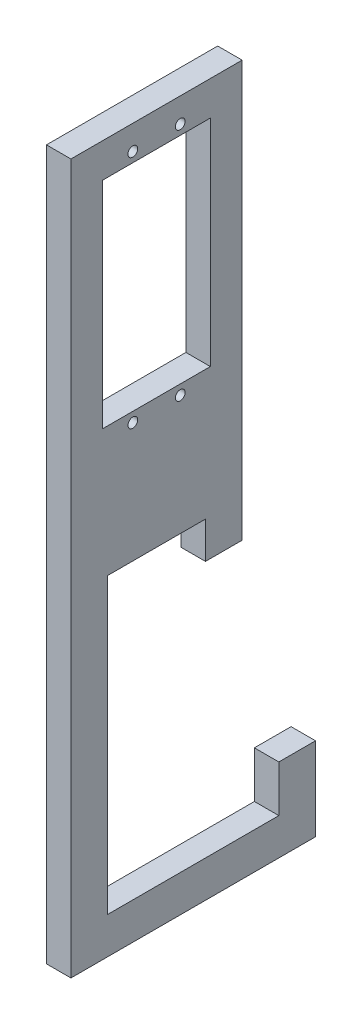
ISO-10303-21;
HEADER;
FILE_DESCRIPTION(('STEP AP214'),'2;1');
FILE_NAME('part.step','',(''),(''),'','','');
FILE_SCHEMA(('AUTOMOTIVE_DESIGN { 1 0 10303 214 1 1 1 1 }'));
ENDSEC;
DATA;
#1=APPLICATION_CONTEXT('core data for automotive mechanical design processes');
#2=APPLICATION_PROTOCOL_DEFINITION('international standard','automotive_design',2000,#1);
#3=PRODUCT_CONTEXT('',#1,'mechanical');
#4=PRODUCT('Part','Part','',(#3));
#5=PRODUCT_RELATED_PRODUCT_CATEGORY('part','',(#4));
#6=PRODUCT_DEFINITION_FORMATION('','',#4);
#7=PRODUCT_DEFINITION_CONTEXT('part definition',#1,'design');
#8=PRODUCT_DEFINITION('design','',#6,#7);
#9=PRODUCT_DEFINITION_SHAPE('','',#8);
#10=(LENGTH_UNIT() NAMED_UNIT(*) SI_UNIT(.MILLI.,.METRE.));
#11=(NAMED_UNIT(*) PLANE_ANGLE_UNIT() SI_UNIT($,.RADIAN.));
#12=(NAMED_UNIT(*) SI_UNIT($,.STERADIAN.) SOLID_ANGLE_UNIT());
#13=UNCERTAINTY_MEASURE_WITH_UNIT(LENGTH_MEASURE(1.E-05),#10,'distance_accuracy_value','');
#14=(GEOMETRIC_REPRESENTATION_CONTEXT(3) GLOBAL_UNCERTAINTY_ASSIGNED_CONTEXT((#13)) GLOBAL_UNIT_ASSIGNED_CONTEXT((#10,
#11,#12)) REPRESENTATION_CONTEXT('',''));
#15=CARTESIAN_POINT('',(0.,0.,0.));
#16=DIRECTION('',(0.,0.,1.));
#17=DIRECTION('',(1.,0.,0.));
#18=AXIS2_PLACEMENT_3D('',#15,#16,#17);
#19=CARTESIAN_POINT('',(2.5,0.,0.));
#20=DIRECTION('',(1.,0.,0.));
#21=DIRECTION('',(0.,0.,-1.));
#22=AXIS2_PLACEMENT_3D('',#19,#20,#21);
#23=PLANE('',#22);
#24=CARTESIAN_POINT('',(2.5,24.,-4.85));
#25=DIRECTION('',(1.,0.,0.));
#26=DIRECTION('',(0.,0.,-1.));
#27=AXIS2_PLACEMENT_3D('',#24,#25,#26);
#28=CIRCLE('',#27,1.);
#29=CARTESIAN_POINT('',(2.5,24.,-5.85));
#30=VERTEX_POINT('',#29);
#31=EDGE_CURVE('E287',#30,#30,#28,.T.);
#32=ORIENTED_EDGE('',*,*,#31,.F.);
#33=EDGE_LOOP('',(#32));
#34=FACE_BOUND('',#33,.T.);
#35=CARTESIAN_POINT('',(2.5,-24.,4.85));
#36=DIRECTION('',(1.,0.,0.));
#37=DIRECTION('',(0.,0.,-1.));
#38=AXIS2_PLACEMENT_3D('',#35,#36,#37);
#39=CIRCLE('',#38,1.);
#40=CARTESIAN_POINT('',(2.5,-24.,3.85));
#41=VERTEX_POINT('',#40);
#42=EDGE_CURVE('E303',#41,#41,#39,.T.);
#43=ORIENTED_EDGE('',*,*,#42,.F.);
#44=EDGE_LOOP('',(#43));
#45=FACE_BOUND('',#44,.T.);
#46=DIRECTION('',(0.,-1.,0.));
#47=VECTOR('',#46,1.);
#48=CARTESIAN_POINT('',(2.5,29.,17.5));
#49=LINE('',#48,#47);
#50=CARTESIAN_POINT('',(2.5,29.,17.5));
#51=VERTEX_POINT('',#50);
#52=CARTESIAN_POINT('',(2.5,-116.,17.5));
#53=VERTEX_POINT('',#52);
#54=EDGE_CURVE('E346',#51,#53,#49,.T.);
#55=ORIENTED_EDGE('',*,*,#54,.T.);
#56=DIRECTION('',(0.,0.,-1.));
#57=VECTOR('',#56,1.);
#58=CARTESIAN_POINT('',(2.5,-116.,-32.5));
#59=LINE('',#58,#57);
#60=CARTESIAN_POINT('',(2.5,-116.,-32.5));
#61=VERTEX_POINT('',#60);
#62=EDGE_CURVE('E175',#53,#61,#59,.T.);
#63=ORIENTED_EDGE('',*,*,#62,.T.);
#64=DIRECTION('',(0.,1.,0.));
#65=VECTOR('',#64,1.);
#66=CARTESIAN_POINT('',(2.5,-99.,-32.5));
#67=LINE('',#66,#65);
#68=CARTESIAN_POINT('',(2.5,-99.,-32.5));
#69=VERTEX_POINT('',#68);
#70=EDGE_CURVE('E246',#61,#69,#67,.T.);
#71=ORIENTED_EDGE('',*,*,#70,.T.);
#72=DIRECTION('',(0.,0.,1.));
#73=VECTOR('',#72,1.);
#74=CARTESIAN_POINT('',(2.5,-99.,-25.));
#75=LINE('',#74,#73);
#76=CARTESIAN_POINT('',(2.5,-99.,-25.));
#77=VERTEX_POINT('',#76);
#78=EDGE_CURVE('E242',#69,#77,#75,.T.);
#79=ORIENTED_EDGE('',*,*,#78,.T.);
#80=DIRECTION('',(0.,-1.,0.));
#81=VECTOR('',#80,1.);
#82=CARTESIAN_POINT('',(2.5,-108.5,-25.));
#83=LINE('',#82,#81);
#84=CARTESIAN_POINT('',(2.5,-108.5,-25.));
#85=VERTEX_POINT('',#84);
#86=EDGE_CURVE('E238',#77,#85,#83,.T.);
#87=ORIENTED_EDGE('',*,*,#86,.T.);
#88=DIRECTION('',(0.,0.,1.));
#89=VECTOR('',#88,1.);
#90=CARTESIAN_POINT('',(2.5,-108.5,9.99999999999998));
#91=LINE('',#90,#89);
#92=CARTESIAN_POINT('',(2.5,-108.5,9.99999999999998));
#93=VERTEX_POINT('',#92);
#94=EDGE_CURVE('E234',#85,#93,#91,.T.);
#95=ORIENTED_EDGE('',*,*,#94,.T.);
#96=DIRECTION('',(0.,1.,0.));
#97=VECTOR('',#96,1.);
#98=CARTESIAN_POINT('',(2.5,-48.5,9.99999999999999));
#99=LINE('',#98,#97);
#100=CARTESIAN_POINT('',(2.5,-48.5,9.99999999999999));
#101=VERTEX_POINT('',#100);
#102=EDGE_CURVE('E230',#93,#101,#99,.T.);
#103=ORIENTED_EDGE('',*,*,#102,.T.);
#104=DIRECTION('',(0.,0.,-1.));
#105=VECTOR('',#104,1.);
#106=CARTESIAN_POINT('',(2.5,-48.5,-9.99999999999999));
#107=LINE('',#106,#105);
#108=CARTESIAN_POINT('',(2.5,-48.5,-9.99999999999999));
#109=VERTEX_POINT('',#108);
#110=EDGE_CURVE('E226',#101,#109,#107,.T.);
#111=ORIENTED_EDGE('',*,*,#110,.T.);
#112=DIRECTION('',(0.,-1.,0.));
#113=VECTOR('',#112,1.);
#114=CARTESIAN_POINT('',(2.5,-56.,-9.99999999999999));
#115=LINE('',#114,#113);
#116=CARTESIAN_POINT('',(2.5,-56.,-9.99999999999999));
#117=VERTEX_POINT('',#116);
#118=EDGE_CURVE('E222',#109,#117,#115,.T.);
#119=ORIENTED_EDGE('',*,*,#118,.T.);
#120=DIRECTION('',(0.,0.,-1.));
#121=VECTOR('',#120,1.);
#122=CARTESIAN_POINT('',(2.5,-56.,-17.5));
#123=LINE('',#122,#121);
#124=CARTESIAN_POINT('',(2.5,-56.,-17.5));
#125=VERTEX_POINT('',#124);
#126=EDGE_CURVE('E217',#117,#125,#123,.T.);
#127=ORIENTED_EDGE('',*,*,#126,.T.);
#128=DIRECTION('',(0.,1.,0.));
#129=VECTOR('',#128,1.);
#130=CARTESIAN_POINT('',(2.5,29.,-17.5));
#131=LINE('',#130,#129);
#132=CARTESIAN_POINT('',(2.5,29.,-17.5));
#133=VERTEX_POINT('',#132);
#134=EDGE_CURVE('E349',#125,#133,#131,.T.);
#135=ORIENTED_EDGE('',*,*,#134,.T.);
#136=DIRECTION('',(0.,0.,1.));
#137=VECTOR('',#136,1.);
#138=CARTESIAN_POINT('',(2.5,29.,17.5));
#139=LINE('',#138,#137);
#140=EDGE_CURVE('E353',#133,#51,#139,.T.);
#141=ORIENTED_EDGE('',*,*,#140,.T.);
#142=EDGE_LOOP('',(#55,#63,#71,#79,#87,#95,#103,#111,#119,#127,#135,#141));
#143=FACE_BOUND('',#142,.T.);
#144=DIRECTION('',(0.,0.,-1.));
#145=VECTOR('',#144,1.);
#146=CARTESIAN_POINT('',(2.5,-22.,11.));
#147=LINE('',#146,#145);
#148=CARTESIAN_POINT('',(2.5,-22.,11.));
#149=VERTEX_POINT('',#148);
#150=CARTESIAN_POINT('',(2.5,-22.,-11.));
#151=VERTEX_POINT('',#150);
#152=EDGE_CURVE('E313',#149,#151,#147,.T.);
#153=ORIENTED_EDGE('',*,*,#152,.F.);
#154=DIRECTION('',(0.,-1.,0.));
#155=VECTOR('',#154,1.);
#156=CARTESIAN_POINT('',(2.5,22.,11.));
#157=LINE('',#156,#155);
#158=CARTESIAN_POINT('',(2.5,22.,11.));
#159=VERTEX_POINT('',#158);
#160=EDGE_CURVE('E310',#159,#149,#157,.T.);
#161=ORIENTED_EDGE('',*,*,#160,.F.);
#162=DIRECTION('',(0.,0.,1.));
#163=VECTOR('',#162,1.);
#164=CARTESIAN_POINT('',(2.5,22.,11.));
#165=LINE('',#164,#163);
#166=CARTESIAN_POINT('',(2.5,22.,-11.));
#167=VERTEX_POINT('',#166);
#168=EDGE_CURVE('E320',#167,#159,#165,.T.);
#169=ORIENTED_EDGE('',*,*,#168,.F.);
#170=DIRECTION('',(0.,1.,0.));
#171=VECTOR('',#170,1.);
#172=CARTESIAN_POINT('',(2.5,22.,-11.));
#173=LINE('',#172,#171);
#174=EDGE_CURVE('E317',#151,#167,#173,.T.);
#175=ORIENTED_EDGE('',*,*,#174,.F.);
#176=EDGE_LOOP('',(#153,#161,#169,#175));
#177=FACE_BOUND('',#176,.T.);
#178=CARTESIAN_POINT('',(2.5,-24.,-4.85));
#179=DIRECTION('',(1.,0.,0.));
#180=DIRECTION('',(0.,0.,-1.));
#181=AXIS2_PLACEMENT_3D('',#178,#179,#180);
#182=CIRCLE('',#181,1.);
#183=CARTESIAN_POINT('',(2.5,-24.,-5.85));
#184=VERTEX_POINT('',#183);
#185=EDGE_CURVE('E295',#184,#184,#182,.T.);
#186=ORIENTED_EDGE('',*,*,#185,.F.);
#187=EDGE_LOOP('',(#186));
#188=FACE_BOUND('',#187,.T.);
#189=CARTESIAN_POINT('',(2.5,24.,4.85));
#190=DIRECTION('',(1.,0.,0.));
#191=DIRECTION('',(0.,0.,-1.));
#192=AXIS2_PLACEMENT_3D('',#189,#190,#191);
#193=CIRCLE('',#192,1.);
#194=CARTESIAN_POINT('',(2.5,24.,3.85));
#195=VERTEX_POINT('',#194);
#196=EDGE_CURVE('E279',#195,#195,#193,.T.);
#197=ORIENTED_EDGE('',*,*,#196,.F.);
#198=EDGE_LOOP('',(#197));
#199=FACE_BOUND('',#198,.T.);
#200=ADVANCED_FACE('F39',(#34,#45,#143,#177,#188,#199),#23,.T.);
#201=CARTESIAN_POINT('',(-2.5,0.,0.));
#202=DIRECTION('',(1.,0.,0.));
#203=DIRECTION('',(0.,0.,-1.));
#204=AXIS2_PLACEMENT_3D('',#201,#202,#203);
#205=PLANE('',#204);
#206=DIRECTION('',(0.,-1.,0.));
#207=VECTOR('',#206,1.);
#208=CARTESIAN_POINT('',(-2.5,29.,17.5));
#209=LINE('',#208,#207);
#210=CARTESIAN_POINT('',(-2.5,29.,17.5));
#211=VERTEX_POINT('',#210);
#212=CARTESIAN_POINT('',(-2.5,-116.,17.5));
#213=VERTEX_POINT('',#212);
#214=EDGE_CURVE('E156',#211,#213,#209,.T.);
#215=ORIENTED_EDGE('',*,*,#214,.F.);
#216=DIRECTION('',(0.,0.,1.));
#217=VECTOR('',#216,1.);
#218=CARTESIAN_POINT('',(-2.5,29.,17.5));
#219=LINE('',#218,#217);
#220=CARTESIAN_POINT('',(-2.5,29.,-17.5));
#221=VERTEX_POINT('',#220);
#222=EDGE_CURVE('E350',#221,#211,#219,.T.);
#223=ORIENTED_EDGE('',*,*,#222,.F.);
#224=DIRECTION('',(0.,1.,0.));
#225=VECTOR('',#224,1.);
#226=CARTESIAN_POINT('',(-2.5,29.,-17.5));
#227=LINE('',#226,#225);
#228=CARTESIAN_POINT('',(-2.5,-56.,-17.5));
#229=VERTEX_POINT('',#228);
#230=EDGE_CURVE('E165',#229,#221,#227,.T.);
#231=ORIENTED_EDGE('',*,*,#230,.F.);
#232=DIRECTION('',(0.,0.,1.));
#233=VECTOR('',#232,1.);
#234=CARTESIAN_POINT('',(-2.5,-56.,-17.5));
#235=LINE('',#234,#233);
#236=CARTESIAN_POINT('',(-2.5,-56.,-9.99999999999999));
#237=VERTEX_POINT('',#236);
#238=EDGE_CURVE('E178',#229,#237,#235,.T.);
#239=ORIENTED_EDGE('',*,*,#238,.T.);
#240=DIRECTION('',(0.,1.,0.));
#241=VECTOR('',#240,1.);
#242=CARTESIAN_POINT('',(-2.5,-56.,-9.99999999999999));
#243=LINE('',#242,#241);
#244=CARTESIAN_POINT('',(-2.5,-48.5,-9.99999999999999));
#245=VERTEX_POINT('',#244);
#246=EDGE_CURVE('E210',#237,#245,#243,.T.);
#247=ORIENTED_EDGE('',*,*,#246,.T.);
#248=DIRECTION('',(0.,0.,1.));
#249=VECTOR('',#248,1.);
#250=CARTESIAN_POINT('',(-2.5,-48.5,-9.99999999999999));
#251=LINE('',#250,#249);
#252=CARTESIAN_POINT('',(-2.5,-48.5,9.99999999999999));
#253=VERTEX_POINT('',#252);
#254=EDGE_CURVE('E206',#245,#253,#251,.T.);
#255=ORIENTED_EDGE('',*,*,#254,.T.);
#256=DIRECTION('',(0.,-1.,0.));
#257=VECTOR('',#256,1.);
#258=CARTESIAN_POINT('',(-2.5,-48.5,9.99999999999999));
#259=LINE('',#258,#257);
#260=CARTESIAN_POINT('',(-2.5,-108.5,9.99999999999998));
#261=VERTEX_POINT('',#260);
#262=EDGE_CURVE('E202',#253,#261,#259,.T.);
#263=ORIENTED_EDGE('',*,*,#262,.T.);
#264=DIRECTION('',(0.,0.,-1.));
#265=VECTOR('',#264,1.);
#266=CARTESIAN_POINT('',(-2.5,-108.5,9.99999999999998));
#267=LINE('',#266,#265);
#268=CARTESIAN_POINT('',(-2.5,-108.5,-25.));
#269=VERTEX_POINT('',#268);
#270=EDGE_CURVE('E198',#261,#269,#267,.T.);
#271=ORIENTED_EDGE('',*,*,#270,.T.);
#272=DIRECTION('',(0.,1.,0.));
#273=VECTOR('',#272,1.);
#274=CARTESIAN_POINT('',(-2.5,-108.5,-25.));
#275=LINE('',#274,#273);
#276=CARTESIAN_POINT('',(-2.5,-99.,-25.));
#277=VERTEX_POINT('',#276);
#278=EDGE_CURVE('E194',#269,#277,#275,.T.);
#279=ORIENTED_EDGE('',*,*,#278,.T.);
#280=DIRECTION('',(0.,0.,-1.));
#281=VECTOR('',#280,1.);
#282=CARTESIAN_POINT('',(-2.5,-99.,-25.));
#283=LINE('',#282,#281);
#284=CARTESIAN_POINT('',(-2.5,-99.,-32.5));
#285=VERTEX_POINT('',#284);
#286=EDGE_CURVE('E189',#277,#285,#283,.T.);
#287=ORIENTED_EDGE('',*,*,#286,.T.);
#288=DIRECTION('',(0.,-1.,0.));
#289=VECTOR('',#288,1.);
#290=CARTESIAN_POINT('',(-2.5,-99.,-32.5));
#291=LINE('',#290,#289);
#292=CARTESIAN_POINT('',(-2.5,-116.,-32.5));
#293=VERTEX_POINT('',#292);
#294=EDGE_CURVE('E185',#285,#293,#291,.T.);
#295=ORIENTED_EDGE('',*,*,#294,.T.);
#296=DIRECTION('',(0.,0.,1.));
#297=VECTOR('',#296,1.);
#298=CARTESIAN_POINT('',(-2.5,-116.,-32.5));
#299=LINE('',#298,#297);
#300=EDGE_CURVE('E173',#293,#213,#299,.T.);
#301=ORIENTED_EDGE('',*,*,#300,.T.);
#302=EDGE_LOOP('',(#215,#223,#231,#239,#247,#255,#263,#271,#279,#287,#295,#301));
#303=FACE_BOUND('',#302,.T.);
#304=DIRECTION('',(0.,-1.,0.));
#305=VECTOR('',#304,1.);
#306=CARTESIAN_POINT('',(-2.5,22.,11.));
#307=LINE('',#306,#305);
#308=CARTESIAN_POINT('',(-2.5,22.,11.));
#309=VERTEX_POINT('',#308);
#310=CARTESIAN_POINT('',(-2.5,-22.,11.));
#311=VERTEX_POINT('',#310);
#312=EDGE_CURVE('E63',#309,#311,#307,.T.);
#313=ORIENTED_EDGE('',*,*,#312,.T.);
#314=DIRECTION('',(0.,0.,-1.));
#315=VECTOR('',#314,1.);
#316=CARTESIAN_POINT('',(-2.5,-22.,11.));
#317=LINE('',#316,#315);
#318=CARTESIAN_POINT('',(-2.5,-22.,-11.));
#319=VERTEX_POINT('',#318);
#320=EDGE_CURVE('E326',#311,#319,#317,.T.);
#321=ORIENTED_EDGE('',*,*,#320,.T.);
#322=DIRECTION('',(0.,1.,0.));
#323=VECTOR('',#322,1.);
#324=CARTESIAN_POINT('',(-2.5,22.,-11.));
#325=LINE('',#324,#323);
#326=CARTESIAN_POINT('',(-2.5,22.,-11.));
#327=VERTEX_POINT('',#326);
#328=EDGE_CURVE('E330',#319,#327,#325,.T.);
#329=ORIENTED_EDGE('',*,*,#328,.T.);
#330=DIRECTION('',(0.,0.,1.));
#331=VECTOR('',#330,1.);
#332=CARTESIAN_POINT('',(-2.5,22.,11.));
#333=LINE('',#332,#331);
#334=EDGE_CURVE('E314',#327,#309,#333,.T.);
#335=ORIENTED_EDGE('',*,*,#334,.T.);
#336=EDGE_LOOP('',(#313,#321,#329,#335));
#337=FACE_BOUND('',#336,.T.);
#338=CARTESIAN_POINT('',(-2.5,-24.,4.85));
#339=DIRECTION('',(1.,0.,0.));
#340=DIRECTION('',(0.,0.,-1.));
#341=AXIS2_PLACEMENT_3D('',#338,#339,#340);
#342=CIRCLE('',#341,1.);
#343=CARTESIAN_POINT('',(-2.5,-24.,3.85));
#344=VERTEX_POINT('',#343);
#345=EDGE_CURVE('E299',#344,#344,#342,.T.);
#346=ORIENTED_EDGE('',*,*,#345,.T.);
#347=EDGE_LOOP('',(#346));
#348=FACE_BOUND('',#347,.T.);
#349=CARTESIAN_POINT('',(-2.5,-24.,-4.85));
#350=DIRECTION('',(1.,0.,0.));
#351=DIRECTION('',(0.,0.,-1.));
#352=AXIS2_PLACEMENT_3D('',#349,#350,#351);
#353=CIRCLE('',#352,1.);
#354=CARTESIAN_POINT('',(-2.5,-24.,-5.85));
#355=VERTEX_POINT('',#354);
#356=EDGE_CURVE('E291',#355,#355,#353,.T.);
#357=ORIENTED_EDGE('',*,*,#356,.T.);
#358=EDGE_LOOP('',(#357));
#359=FACE_BOUND('',#358,.T.);
#360=CARTESIAN_POINT('',(-2.5,24.,-4.85));
#361=DIRECTION('',(1.,0.,0.));
#362=DIRECTION('',(0.,0.,-1.));
#363=AXIS2_PLACEMENT_3D('',#360,#361,#362);
#364=CIRCLE('',#363,1.);
#365=CARTESIAN_POINT('',(-2.5,24.,-5.85));
#366=VERTEX_POINT('',#365);
#367=EDGE_CURVE('E283',#366,#366,#364,.T.);
#368=ORIENTED_EDGE('',*,*,#367,.T.);
#369=EDGE_LOOP('',(#368));
#370=FACE_BOUND('',#369,.T.);
#371=CARTESIAN_POINT('',(-2.5,24.,4.85));
#372=DIRECTION('',(1.,0.,0.));
#373=DIRECTION('',(0.,0.,-1.));
#374=AXIS2_PLACEMENT_3D('',#371,#372,#373);
#375=CIRCLE('',#374,1.);
#376=CARTESIAN_POINT('',(-2.5,24.,3.85));
#377=VERTEX_POINT('',#376);
#378=EDGE_CURVE('E221',#377,#377,#375,.T.);
#379=ORIENTED_EDGE('',*,*,#378,.T.);
#380=EDGE_LOOP('',(#379));
#381=FACE_BOUND('',#380,.T.);
#382=ADVANCED_FACE('F181',(#303,#337,#348,#359,#370,#381),#205,.F.);
#383=CARTESIAN_POINT('',(2.5,29.,17.5));
#384=DIRECTION('',(0.,0.,-1.));
#385=DIRECTION('',(0.,1.,0.));
#386=AXIS2_PLACEMENT_3D('',#383,#384,#385);
#387=PLANE('',#386);
#388=ORIENTED_EDGE('',*,*,#214,.T.);
#389=DIRECTION('',(-1.,0.,0.));
#390=VECTOR('',#389,1.);
#391=CARTESIAN_POINT('',(92.6387818865997,-116.,17.5));
#392=LINE('',#391,#390);
#393=EDGE_CURVE('E159',#53,#213,#392,.T.);
#394=ORIENTED_EDGE('',*,*,#393,.F.);
#395=ORIENTED_EDGE('',*,*,#54,.F.);
#396=DIRECTION('',(-1.,0.,0.));
#397=VECTOR('',#396,1.);
#398=CARTESIAN_POINT('',(2.5,29.,17.5));
#399=LINE('',#398,#397);
#400=EDGE_CURVE('E48',#51,#211,#399,.T.);
#401=ORIENTED_EDGE('',*,*,#400,.T.);
#402=EDGE_LOOP('',(#388,#394,#395,#401));
#403=FACE_BOUND('',#402,.T.);
#404=ADVANCED_FACE('F41',(#403),#387,.F.);
#405=CARTESIAN_POINT('',(2.5,29.,-17.5));
#406=DIRECTION('',(0.,0.,1.));
#407=DIRECTION('',(0.,-1.,0.));
#408=AXIS2_PLACEMENT_3D('',#405,#406,#407);
#409=PLANE('',#408);
#410=ORIENTED_EDGE('',*,*,#230,.T.);
#411=DIRECTION('',(-1.,0.,0.));
#412=VECTOR('',#411,1.);
#413=CARTESIAN_POINT('',(2.5,29.,-17.5));
#414=LINE('',#413,#412);
#415=EDGE_CURVE('E11',#133,#221,#414,.T.);
#416=ORIENTED_EDGE('',*,*,#415,.F.);
#417=ORIENTED_EDGE('',*,*,#134,.F.);
#418=DIRECTION('',(-1.,0.,0.));
#419=VECTOR('',#418,1.);
#420=CARTESIAN_POINT('',(92.6387818865997,-56.,-17.5));
#421=LINE('',#420,#419);
#422=EDGE_CURVE('E251',#125,#229,#421,.T.);
#423=ORIENTED_EDGE('',*,*,#422,.T.);
#424=EDGE_LOOP('',(#410,#416,#417,#423));
#425=FACE_BOUND('',#424,.T.);
#426=ADVANCED_FACE('F368',(#425),#409,.F.);
#427=CARTESIAN_POINT('',(2.5,29.,17.5));
#428=DIRECTION('',(0.,-1.,0.));
#429=DIRECTION('',(0.,0.,-1.));
#430=AXIS2_PLACEMENT_3D('',#427,#428,#429);
#431=PLANE('',#430);
#432=ORIENTED_EDGE('',*,*,#222,.T.);
#433=ORIENTED_EDGE('',*,*,#400,.F.);
#434=ORIENTED_EDGE('',*,*,#140,.F.);
#435=ORIENTED_EDGE('',*,*,#415,.T.);
#436=EDGE_LOOP('',(#432,#433,#434,#435));
#437=FACE_BOUND('',#436,.T.);
#438=ADVANCED_FACE('F361',(#437),#431,.F.);
#439=CARTESIAN_POINT('',(2.5,22.,11.));
#440=DIRECTION('',(0.,0.,-1.));
#441=DIRECTION('',(0.,1.,0.));
#442=AXIS2_PLACEMENT_3D('',#439,#440,#441);
#443=PLANE('',#442);
#444=ORIENTED_EDGE('',*,*,#312,.F.);
#445=DIRECTION('',(-1.,0.,0.));
#446=VECTOR('',#445,1.);
#447=CARTESIAN_POINT('',(2.5,22.,11.));
#448=LINE('',#447,#446);
#449=EDGE_CURVE('E323',#159,#309,#448,.T.);
#450=ORIENTED_EDGE('',*,*,#449,.F.);
#451=ORIENTED_EDGE('',*,*,#160,.T.);
#452=DIRECTION('',(-1.,0.,0.));
#453=VECTOR('',#452,1.);
#454=CARTESIAN_POINT('',(2.5,-22.,11.));
#455=LINE('',#454,#453);
#456=EDGE_CURVE('E166',#149,#311,#455,.T.);
#457=ORIENTED_EDGE('',*,*,#456,.T.);
#458=EDGE_LOOP('',(#444,#450,#451,#457));
#459=FACE_BOUND('',#458,.T.);
#460=ADVANCED_FACE('F418',(#459),#443,.T.);
#461=CARTESIAN_POINT('',(2.5,-22.,11.));
#462=DIRECTION('',(0.,1.,0.));
#463=DIRECTION('',(0.,0.,1.));
#464=AXIS2_PLACEMENT_3D('',#461,#462,#463);
#465=PLANE('',#464);
#466=ORIENTED_EDGE('',*,*,#320,.F.);
#467=ORIENTED_EDGE('',*,*,#456,.F.);
#468=ORIENTED_EDGE('',*,*,#152,.T.);
#469=DIRECTION('',(-1.,0.,0.));
#470=VECTOR('',#469,1.);
#471=CARTESIAN_POINT('',(2.5,-22.,-11.));
#472=LINE('',#471,#470);
#473=EDGE_CURVE('E341',#151,#319,#472,.T.);
#474=ORIENTED_EDGE('',*,*,#473,.T.);
#475=EDGE_LOOP('',(#466,#467,#468,#474));
#476=FACE_BOUND('',#475,.T.);
#477=ADVANCED_FACE('F496',(#476),#465,.T.);
#478=CARTESIAN_POINT('',(2.5,22.,-11.));
#479=DIRECTION('',(0.,0.,1.));
#480=DIRECTION('',(1.,0.,0.));
#481=AXIS2_PLACEMENT_3D('',#478,#479,#480);
#482=PLANE('',#481);
#483=ORIENTED_EDGE('',*,*,#328,.F.);
#484=ORIENTED_EDGE('',*,*,#473,.F.);
#485=ORIENTED_EDGE('',*,*,#174,.T.);
#486=DIRECTION('',(-1.,0.,0.));
#487=VECTOR('',#486,1.);
#488=CARTESIAN_POINT('',(2.5,22.,-11.));
#489=LINE('',#488,#487);
#490=EDGE_CURVE('E55',#167,#327,#489,.T.);
#491=ORIENTED_EDGE('',*,*,#490,.T.);
#492=EDGE_LOOP('',(#483,#484,#485,#491));
#493=FACE_BOUND('',#492,.T.);
#494=ADVANCED_FACE('F487',(#493),#482,.T.);
#495=CARTESIAN_POINT('',(2.5,22.,11.));
#496=DIRECTION('',(0.,-1.,0.));
#497=DIRECTION('',(0.,0.,-1.));
#498=AXIS2_PLACEMENT_3D('',#495,#496,#497);
#499=PLANE('',#498);
#500=ORIENTED_EDGE('',*,*,#334,.F.);
#501=ORIENTED_EDGE('',*,*,#490,.F.);
#502=ORIENTED_EDGE('',*,*,#168,.T.);
#503=ORIENTED_EDGE('',*,*,#449,.T.);
#504=EDGE_LOOP('',(#500,#501,#502,#503));
#505=FACE_BOUND('',#504,.T.);
#506=ADVANCED_FACE('F477',(#505),#499,.T.);
#507=CARTESIAN_POINT('',(2.5,-24.,4.85));
#508=DIRECTION('',(-1.,0.,0.));
#509=DIRECTION('',(0.,0.,1.));
#510=AXIS2_PLACEMENT_3D('',#507,#508,#509);
#511=CYLINDRICAL_SURFACE('',#510,1.);
#512=ORIENTED_EDGE('',*,*,#42,.T.);
#513=EDGE_LOOP('',(#512));
#514=FACE_BOUND('',#513,.T.);
#515=ORIENTED_EDGE('',*,*,#345,.F.);
#516=EDGE_LOOP('',(#515));
#517=FACE_BOUND('',#516,.T.);
#518=ADVANCED_FACE('F467',(#514,#517),#511,.F.);
#519=CARTESIAN_POINT('',(2.5,-24.,-4.85));
#520=DIRECTION('',(-1.,0.,0.));
#521=DIRECTION('',(0.,0.,1.));
#522=AXIS2_PLACEMENT_3D('',#519,#520,#521);
#523=CYLINDRICAL_SURFACE('',#522,1.);
#524=ORIENTED_EDGE('',*,*,#185,.T.);
#525=EDGE_LOOP('',(#524));
#526=FACE_BOUND('',#525,.T.);
#527=ORIENTED_EDGE('',*,*,#356,.F.);
#528=EDGE_LOOP('',(#527));
#529=FACE_BOUND('',#528,.T.);
#530=ADVANCED_FACE('F457',(#526,#529),#523,.F.);
#531=CARTESIAN_POINT('',(2.5,24.,-4.85));
#532=DIRECTION('',(-1.,0.,0.));
#533=DIRECTION('',(0.,0.,1.));
#534=AXIS2_PLACEMENT_3D('',#531,#532,#533);
#535=CYLINDRICAL_SURFACE('',#534,1.);
#536=ORIENTED_EDGE('',*,*,#31,.T.);
#537=EDGE_LOOP('',(#536));
#538=FACE_BOUND('',#537,.T.);
#539=ORIENTED_EDGE('',*,*,#367,.F.);
#540=EDGE_LOOP('',(#539));
#541=FACE_BOUND('',#540,.T.);
#542=ADVANCED_FACE('F447',(#538,#541),#535,.F.);
#543=CARTESIAN_POINT('',(2.5,24.,4.85));
#544=DIRECTION('',(-1.,0.,0.));
#545=DIRECTION('',(0.,0.,1.));
#546=AXIS2_PLACEMENT_3D('',#543,#544,#545);
#547=CYLINDRICAL_SURFACE('',#546,1.);
#548=ORIENTED_EDGE('',*,*,#196,.T.);
#549=EDGE_LOOP('',(#548));
#550=FACE_BOUND('',#549,.T.);
#551=ORIENTED_EDGE('',*,*,#378,.F.);
#552=EDGE_LOOP('',(#551));
#553=FACE_BOUND('',#552,.T.);
#554=ADVANCED_FACE('F406',(#550,#553),#547,.F.);
#555=CARTESIAN_POINT('',(92.6387818865997,-116.,-32.5));
#556=DIRECTION('',(0.,1.,0.));
#557=DIRECTION('',(0.,0.,1.));
#558=AXIS2_PLACEMENT_3D('',#555,#556,#557);
#559=PLANE('',#558);
#560=ORIENTED_EDGE('',*,*,#62,.F.);
#561=ORIENTED_EDGE('',*,*,#393,.T.);
#562=ORIENTED_EDGE('',*,*,#300,.F.);
#563=DIRECTION('',(-1.,0.,0.));
#564=VECTOR('',#563,1.);
#565=CARTESIAN_POINT('',(92.6387818865997,-116.,-32.5));
#566=LINE('',#565,#564);
#567=EDGE_CURVE('E177',#61,#293,#566,.T.);
#568=ORIENTED_EDGE('',*,*,#567,.F.);
#569=EDGE_LOOP('',(#560,#561,#562,#568));
#570=FACE_BOUND('',#569,.T.);
#571=ADVANCED_FACE('F171',(#570),#559,.F.);
#572=CARTESIAN_POINT('',(92.6387818865997,-99.,-32.5));
#573=DIRECTION('',(0.,0.,1.));
#574=DIRECTION('',(0.,-1.,0.));
#575=AXIS2_PLACEMENT_3D('',#572,#573,#574);
#576=PLANE('',#575);
#577=ORIENTED_EDGE('',*,*,#70,.F.);
#578=ORIENTED_EDGE('',*,*,#567,.T.);
#579=ORIENTED_EDGE('',*,*,#294,.F.);
#580=DIRECTION('',(-1.,0.,0.));
#581=VECTOR('',#580,1.);
#582=CARTESIAN_POINT('',(92.6387818865997,-99.,-32.5));
#583=LINE('',#582,#581);
#584=EDGE_CURVE('E255',#69,#285,#583,.T.);
#585=ORIENTED_EDGE('',*,*,#584,.F.);
#586=EDGE_LOOP('',(#577,#578,#579,#585));
#587=FACE_BOUND('',#586,.T.);
#588=ADVANCED_FACE('F398',(#587),#576,.F.);
#589=CARTESIAN_POINT('',(92.6387818865997,-99.,-25.));
#590=DIRECTION('',(0.,-1.,0.));
#591=DIRECTION('',(0.,0.,-1.));
#592=AXIS2_PLACEMENT_3D('',#589,#590,#591);
#593=PLANE('',#592);
#594=ORIENTED_EDGE('',*,*,#78,.F.);
#595=ORIENTED_EDGE('',*,*,#584,.T.);
#596=ORIENTED_EDGE('',*,*,#286,.F.);
#597=DIRECTION('',(-1.,0.,0.));
#598=VECTOR('',#597,1.);
#599=CARTESIAN_POINT('',(92.6387818865997,-99.,-25.));
#600=LINE('',#599,#598);
#601=EDGE_CURVE('E258',#77,#277,#600,.T.);
#602=ORIENTED_EDGE('',*,*,#601,.F.);
#603=EDGE_LOOP('',(#594,#595,#596,#602));
#604=FACE_BOUND('',#603,.T.);
#605=ADVANCED_FACE('F395',(#604),#593,.F.);
#606=CARTESIAN_POINT('',(92.6387818865997,-108.5,-25.));
#607=DIRECTION('',(0.,0.,-1.));
#608=DIRECTION('',(-1.,0.,0.));
#609=AXIS2_PLACEMENT_3D('',#606,#607,#608);
#610=PLANE('',#609);
#611=ORIENTED_EDGE('',*,*,#86,.F.);
#612=ORIENTED_EDGE('',*,*,#601,.T.);
#613=ORIENTED_EDGE('',*,*,#278,.F.);
#614=DIRECTION('',(-1.,0.,0.));
#615=VECTOR('',#614,1.);
#616=CARTESIAN_POINT('',(92.6387818865997,-108.5,-25.));
#617=LINE('',#616,#615);
#618=EDGE_CURVE('E261',#85,#269,#617,.T.);
#619=ORIENTED_EDGE('',*,*,#618,.F.);
#620=EDGE_LOOP('',(#611,#612,#613,#619));
#621=FACE_BOUND('',#620,.T.);
#622=ADVANCED_FACE('F391',(#621),#610,.F.);
#623=CARTESIAN_POINT('',(92.6387818865997,-108.5,9.99999999999998));
#624=DIRECTION('',(0.,-1.,0.));
#625=DIRECTION('',(0.,0.,-1.));
#626=AXIS2_PLACEMENT_3D('',#623,#624,#625);
#627=PLANE('',#626);
#628=ORIENTED_EDGE('',*,*,#94,.F.);
#629=ORIENTED_EDGE('',*,*,#618,.T.);
#630=ORIENTED_EDGE('',*,*,#270,.F.);
#631=DIRECTION('',(-1.,0.,0.));
#632=VECTOR('',#631,1.);
#633=CARTESIAN_POINT('',(92.6387818865997,-108.5,9.99999999999998));
#634=LINE('',#633,#632);
#635=EDGE_CURVE('E264',#93,#261,#634,.T.);
#636=ORIENTED_EDGE('',*,*,#635,.F.);
#637=EDGE_LOOP('',(#628,#629,#630,#636));
#638=FACE_BOUND('',#637,.T.);
#639=ADVANCED_FACE('F388',(#638),#627,.F.);
#640=CARTESIAN_POINT('',(92.6387818865997,-48.5,9.99999999999999));
#641=DIRECTION('',(0.,0.,1.));
#642=DIRECTION('',(0.,-1.,0.));
#643=AXIS2_PLACEMENT_3D('',#640,#641,#642);
#644=PLANE('',#643);
#645=ORIENTED_EDGE('',*,*,#102,.F.);
#646=ORIENTED_EDGE('',*,*,#635,.T.);
#647=ORIENTED_EDGE('',*,*,#262,.F.);
#648=DIRECTION('',(-1.,0.,0.));
#649=VECTOR('',#648,1.);
#650=CARTESIAN_POINT('',(92.6387818865997,-48.5,9.99999999999999));
#651=LINE('',#650,#649);
#652=EDGE_CURVE('E267',#101,#253,#651,.T.);
#653=ORIENTED_EDGE('',*,*,#652,.F.);
#654=EDGE_LOOP('',(#645,#646,#647,#653));
#655=FACE_BOUND('',#654,.T.);
#656=ADVANCED_FACE('F383',(#655),#644,.F.);
#657=CARTESIAN_POINT('',(92.6387818865997,-48.5,-9.99999999999999));
#658=DIRECTION('',(0.,1.,0.));
#659=DIRECTION('',(0.,0.,1.));
#660=AXIS2_PLACEMENT_3D('',#657,#658,#659);
#661=PLANE('',#660);
#662=ORIENTED_EDGE('',*,*,#110,.F.);
#663=ORIENTED_EDGE('',*,*,#652,.T.);
#664=ORIENTED_EDGE('',*,*,#254,.F.);
#665=DIRECTION('',(-1.,0.,0.));
#666=VECTOR('',#665,1.);
#667=CARTESIAN_POINT('',(92.6387818865997,-48.5,-9.99999999999999));
#668=LINE('',#667,#666);
#669=EDGE_CURVE('E270',#109,#245,#668,.T.);
#670=ORIENTED_EDGE('',*,*,#669,.F.);
#671=EDGE_LOOP('',(#662,#663,#664,#670));
#672=FACE_BOUND('',#671,.T.);
#673=ADVANCED_FACE('F379',(#672),#661,.F.);
#674=CARTESIAN_POINT('',(92.6387818865997,-56.,-9.99999999999999));
#675=DIRECTION('',(0.,0.,-1.));
#676=DIRECTION('',(0.,1.,0.));
#677=AXIS2_PLACEMENT_3D('',#674,#675,#676);
#678=PLANE('',#677);
#679=ORIENTED_EDGE('',*,*,#118,.F.);
#680=ORIENTED_EDGE('',*,*,#669,.T.);
#681=ORIENTED_EDGE('',*,*,#246,.F.);
#682=DIRECTION('',(-1.,0.,0.));
#683=VECTOR('',#682,1.);
#684=CARTESIAN_POINT('',(92.6387818865997,-56.,-9.99999999999999));
#685=LINE('',#684,#683);
#686=EDGE_CURVE('E273',#117,#237,#685,.T.);
#687=ORIENTED_EDGE('',*,*,#686,.F.);
#688=EDGE_LOOP('',(#679,#680,#681,#687));
#689=FACE_BOUND('',#688,.T.);
#690=ADVANCED_FACE('F373',(#689),#678,.F.);
#691=CARTESIAN_POINT('',(92.6387818865997,-56.,-17.5));
#692=DIRECTION('',(0.,1.,0.));
#693=DIRECTION('',(0.,0.,1.));
#694=AXIS2_PLACEMENT_3D('',#691,#692,#693);
#695=PLANE('',#694);
#696=ORIENTED_EDGE('',*,*,#126,.F.);
#697=ORIENTED_EDGE('',*,*,#686,.T.);
#698=ORIENTED_EDGE('',*,*,#238,.F.);
#699=ORIENTED_EDGE('',*,*,#422,.F.);
#700=EDGE_LOOP('',(#696,#697,#698,#699));
#701=FACE_BOUND('',#700,.T.);
#702=ADVANCED_FACE('F370',(#701),#695,.F.);
#703=CLOSED_SHELL('',(#200,#382,#404,#426,#438,#460,#477,#494,#506,#518,#530,#542,#554,#571,
#588,#605,#622,#639,#656,#673,#690,#702));
#704=MANIFOLD_SOLID_BREP('B2',#703);
#705=ADVANCED_BREP_SHAPE_REPRESENTATION('',(#18,#704),#14);
#706=SHAPE_DEFINITION_REPRESENTATION(#9,#705);
ENDSEC;
END-ISO-10303-21;
